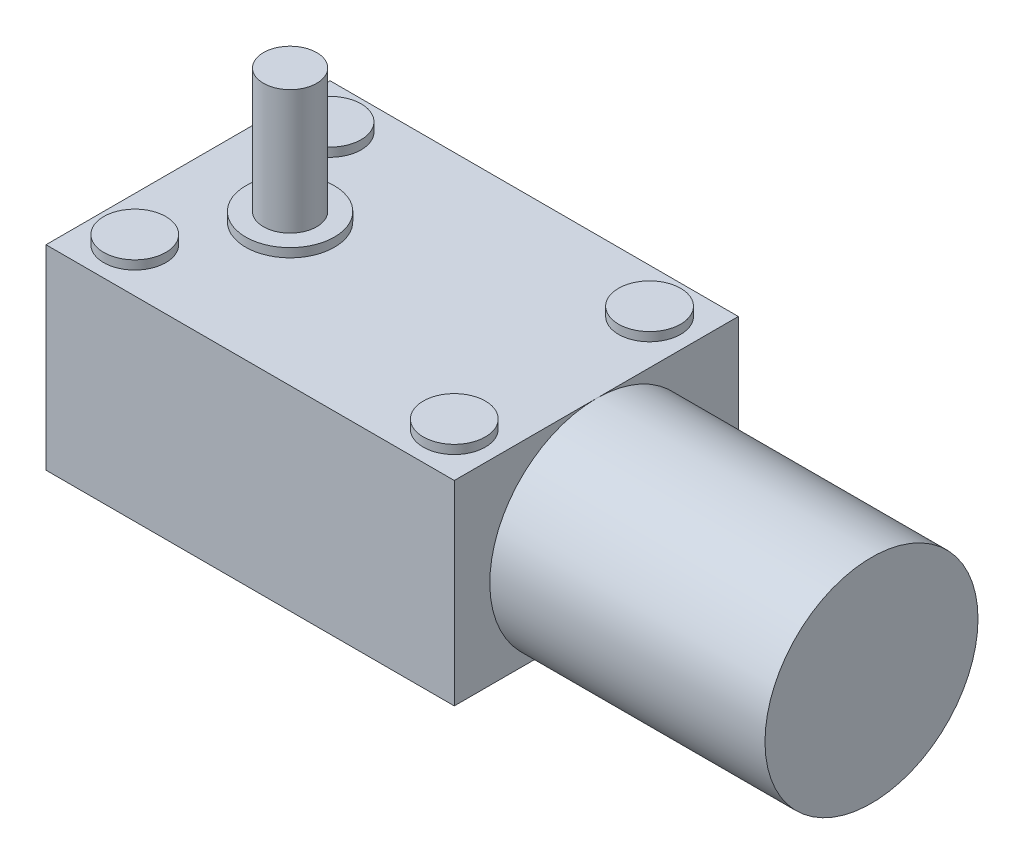
ISO-10303-21;
HEADER;
FILE_DESCRIPTION(('STEP AP214'),'2;1');
FILE_NAME('part.step','',(''),(''),'','','');
FILE_SCHEMA(('AUTOMOTIVE_DESIGN { 1 0 10303 214 1 1 1 1 }'));
ENDSEC;
DATA;
#1=APPLICATION_CONTEXT('core data for automotive mechanical design processes');
#2=APPLICATION_PROTOCOL_DEFINITION('international standard','automotive_design',2000,#1);
#3=PRODUCT_CONTEXT('',#1,'mechanical');
#4=PRODUCT('Part','Part','',(#3));
#5=PRODUCT_RELATED_PRODUCT_CATEGORY('part','',(#4));
#6=PRODUCT_DEFINITION_FORMATION('','',#4);
#7=PRODUCT_DEFINITION_CONTEXT('part definition',#1,'design');
#8=PRODUCT_DEFINITION('design','',#6,#7);
#9=PRODUCT_DEFINITION_SHAPE('','',#8);
#10=(LENGTH_UNIT() NAMED_UNIT(*) SI_UNIT(.MILLI.,.METRE.));
#11=(NAMED_UNIT(*) PLANE_ANGLE_UNIT() SI_UNIT($,.RADIAN.));
#12=(NAMED_UNIT(*) SI_UNIT($,.STERADIAN.) SOLID_ANGLE_UNIT());
#13=UNCERTAINTY_MEASURE_WITH_UNIT(LENGTH_MEASURE(1.E-05),#10,'distance_accuracy_value','');
#14=(GEOMETRIC_REPRESENTATION_CONTEXT(3) GLOBAL_UNCERTAINTY_ASSIGNED_CONTEXT((#13)) GLOBAL_UNIT_ASSIGNED_CONTEXT((#10,
#11,#12)) REPRESENTATION_CONTEXT('',''));
#15=CARTESIAN_POINT('',(0.,0.,0.));
#16=DIRECTION('',(0.,0.,1.));
#17=DIRECTION('',(1.,0.,0.));
#18=AXIS2_PLACEMENT_3D('',#15,#16,#17);
#19=CARTESIAN_POINT('',(23.,22.,16.));
#20=DIRECTION('',(-1.,0.,0.));
#21=DIRECTION('',(0.,0.,1.));
#22=AXIS2_PLACEMENT_3D('',#19,#20,#21);
#23=PLANE('',#22);
#24=CARTESIAN_POINT('',(23.,10.,0.));
#25=DIRECTION('',(1.,0.,0.));
#26=DIRECTION('',(0.,0.,-1.));
#27=AXIS2_PLACEMENT_3D('',#24,#25,#26);
#28=CIRCLE('',#27,12.);
#29=CARTESIAN_POINT('',(23.,22.,0.));
#30=VERTEX_POINT('',#29);
#31=CARTESIAN_POINT('',(23.,0.,6.63324958071081));
#32=VERTEX_POINT('',#31);
#33=EDGE_CURVE('E110',#30,#32,#28,.T.);
#34=ORIENTED_EDGE('',*,*,#33,.F.);
#35=DIRECTION('',(0.,0.,-1.));
#36=VECTOR('',#35,1.);
#37=CARTESIAN_POINT('',(23.,22.,16.));
#38=LINE('',#37,#36);
#39=CARTESIAN_POINT('',(23.,22.,16.));
#40=VERTEX_POINT('',#39);
#41=EDGE_CURVE('E91',#40,#30,#38,.T.);
#42=ORIENTED_EDGE('',*,*,#41,.F.);
#43=DIRECTION('',(0.,-1.,0.));
#44=VECTOR('',#43,1.);
#45=CARTESIAN_POINT('',(23.,22.,16.));
#46=LINE('',#45,#44);
#47=CARTESIAN_POINT('',(23.,0.,16.));
#48=VERTEX_POINT('',#47);
#49=EDGE_CURVE('E166',#40,#48,#46,.T.);
#50=ORIENTED_EDGE('',*,*,#49,.T.);
#51=DIRECTION('',(0.,0.,-1.));
#52=VECTOR('',#51,1.);
#53=CARTESIAN_POINT('',(23.,0.,16.));
#54=LINE('',#53,#52);
#55=EDGE_CURVE('E111',#48,#32,#54,.T.);
#56=ORIENTED_EDGE('',*,*,#55,.T.);
#57=EDGE_LOOP('',(#34,#42,#50,#56));
#58=FACE_BOUND('',#57,.T.);
#59=ADVANCED_FACE('F39',(#58),#23,.F.);
#60=CARTESIAN_POINT('',(23.,0.,-6.63324958071081));
#61=VERTEX_POINT('',#60);
#62=EDGE_CURVE('E55',#61,#30,#28,.T.);
#63=ORIENTED_EDGE('',*,*,#62,.F.);
#64=CARTESIAN_POINT('',(23.,0.,-16.));
#65=VERTEX_POINT('',#64);
#66=EDGE_CURVE('E145',#61,#65,#54,.T.);
#67=ORIENTED_EDGE('',*,*,#66,.T.);
#68=DIRECTION('',(0.,-1.,0.));
#69=VECTOR('',#68,1.);
#70=CARTESIAN_POINT('',(23.,22.,-16.));
#71=LINE('',#70,#69);
#72=CARTESIAN_POINT('',(23.,22.,-16.));
#73=VERTEX_POINT('',#72);
#74=EDGE_CURVE('E106',#73,#65,#71,.T.);
#75=ORIENTED_EDGE('',*,*,#74,.F.);
#76=EDGE_CURVE('E93',#30,#73,#38,.T.);
#77=ORIENTED_EDGE('',*,*,#76,.F.);
#78=EDGE_LOOP('',(#63,#67,#75,#77));
#79=FACE_BOUND('',#78,.T.);
#80=ADVANCED_FACE('F41',(#79),#23,.F.);
#81=CARTESIAN_POINT('',(-23.,22.,-16.));
#82=DIRECTION('',(0.,0.,1.));
#83=DIRECTION('',(1.,0.,0.));
#84=AXIS2_PLACEMENT_3D('',#81,#82,#83);
#85=PLANE('',#84);
#86=DIRECTION('',(-1.,0.,0.));
#87=VECTOR('',#86,1.);
#88=CARTESIAN_POINT('',(-23.,0.,-16.));
#89=LINE('',#88,#87);
#90=CARTESIAN_POINT('',(-23.,0.,-16.));
#91=VERTEX_POINT('',#90);
#92=EDGE_CURVE('E155',#65,#91,#89,.T.);
#93=ORIENTED_EDGE('',*,*,#92,.T.);
#94=DIRECTION('',(0.,-1.,0.));
#95=VECTOR('',#94,1.);
#96=CARTESIAN_POINT('',(-23.,22.,-16.));
#97=LINE('',#96,#95);
#98=CARTESIAN_POINT('',(-23.,22.,-16.));
#99=VERTEX_POINT('',#98);
#100=EDGE_CURVE('E127',#99,#91,#97,.T.);
#101=ORIENTED_EDGE('',*,*,#100,.F.);
#102=DIRECTION('',(-1.,0.,0.));
#103=VECTOR('',#102,1.);
#104=CARTESIAN_POINT('',(-23.,22.,-16.));
#105=LINE('',#104,#103);
#106=EDGE_CURVE('E102',#73,#99,#105,.T.);
#107=ORIENTED_EDGE('',*,*,#106,.F.);
#108=ORIENTED_EDGE('',*,*,#74,.T.);
#109=EDGE_LOOP('',(#93,#101,#107,#108));
#110=FACE_BOUND('',#109,.T.);
#111=ADVANCED_FACE('F218',(#110),#85,.F.);
#112=CARTESIAN_POINT('',(-23.,22.,16.));
#113=DIRECTION('',(1.,0.,0.));
#114=DIRECTION('',(0.,0.,-1.));
#115=AXIS2_PLACEMENT_3D('',#112,#113,#114);
#116=PLANE('',#115);
#117=DIRECTION('',(0.,0.,1.));
#118=VECTOR('',#117,1.);
#119=CARTESIAN_POINT('',(-23.,0.,16.));
#120=LINE('',#119,#118);
#121=CARTESIAN_POINT('',(-23.,0.,16.));
#122=VERTEX_POINT('',#121);
#123=EDGE_CURVE('E157',#91,#122,#120,.T.);
#124=ORIENTED_EDGE('',*,*,#123,.T.);
#125=DIRECTION('',(0.,-1.,0.));
#126=VECTOR('',#125,1.);
#127=CARTESIAN_POINT('',(-23.,22.,16.));
#128=LINE('',#127,#126);
#129=CARTESIAN_POINT('',(-23.,22.,16.));
#130=VERTEX_POINT('',#129);
#131=EDGE_CURVE('E169',#130,#122,#128,.T.);
#132=ORIENTED_EDGE('',*,*,#131,.F.);
#133=DIRECTION('',(0.,0.,1.));
#134=VECTOR('',#133,1.);
#135=CARTESIAN_POINT('',(-23.,22.,16.));
#136=LINE('',#135,#134);
#137=EDGE_CURVE('E434',#99,#130,#136,.T.);
#138=ORIENTED_EDGE('',*,*,#137,.F.);
#139=ORIENTED_EDGE('',*,*,#100,.T.);
#140=EDGE_LOOP('',(#124,#132,#138,#139));
#141=FACE_BOUND('',#140,.T.);
#142=ADVANCED_FACE('F222',(#141),#116,.F.);
#143=CARTESIAN_POINT('',(-23.,22.,16.));
#144=DIRECTION('',(0.,0.,-1.));
#145=DIRECTION('',(-1.,0.,0.));
#146=AXIS2_PLACEMENT_3D('',#143,#144,#145);
#147=PLANE('',#146);
#148=DIRECTION('',(1.,0.,0.));
#149=VECTOR('',#148,1.);
#150=CARTESIAN_POINT('',(-23.,0.,16.));
#151=LINE('',#150,#149);
#152=EDGE_CURVE('E108',#122,#48,#151,.T.);
#153=ORIENTED_EDGE('',*,*,#152,.T.);
#154=ORIENTED_EDGE('',*,*,#49,.F.);
#155=DIRECTION('',(1.,0.,0.));
#156=VECTOR('',#155,1.);
#157=CARTESIAN_POINT('',(-23.,22.,16.));
#158=LINE('',#157,#156);
#159=EDGE_CURVE('E96',#130,#40,#158,.T.);
#160=ORIENTED_EDGE('',*,*,#159,.F.);
#161=ORIENTED_EDGE('',*,*,#131,.T.);
#162=EDGE_LOOP('',(#153,#154,#160,#161));
#163=FACE_BOUND('',#162,.T.);
#164=ADVANCED_FACE('F191',(#163),#147,.F.);
#165=CARTESIAN_POINT('',(0.,22.,0.));
#166=DIRECTION('',(0.,-1.,0.));
#167=DIRECTION('',(0.,0.,-1.));
#168=AXIS2_PLACEMENT_3D('',#165,#166,#167);
#169=PLANE('',#168);
#170=CARTESIAN_POINT('',(-18.,22.,-11.));
#171=DIRECTION('',(0.,-1.,0.));
#172=DIRECTION('',(0.,0.,-1.));
#173=AXIS2_PLACEMENT_3D('',#170,#171,#172);
#174=CIRCLE('',#173,3.5);
#175=CARTESIAN_POINT('',(-18.,22.,-14.5));
#176=VERTEX_POINT('',#175);
#177=EDGE_CURVE('E11',#176,#176,#174,.F.);
#178=ORIENTED_EDGE('',*,*,#177,.F.);
#179=EDGE_LOOP('',(#178));
#180=FACE_BOUND('',#179,.T.);
#181=CARTESIAN_POINT('',(-18.,22.,11.));
#182=DIRECTION('',(0.,-1.,0.));
#183=DIRECTION('',(0.,0.,-1.));
#184=AXIS2_PLACEMENT_3D('',#181,#182,#183);
#185=CIRCLE('',#184,3.5);
#186=CARTESIAN_POINT('',(-18.,22.,7.5));
#187=VERTEX_POINT('',#186);
#188=EDGE_CURVE('E48',#187,#187,#185,.F.);
#189=ORIENTED_EDGE('',*,*,#188,.F.);
#190=EDGE_LOOP('',(#189));
#191=FACE_BOUND('',#190,.T.);
#192=CARTESIAN_POINT('',(18.,22.,11.));
#193=DIRECTION('',(0.,-1.,0.));
#194=DIRECTION('',(0.,0.,-1.));
#195=AXIS2_PLACEMENT_3D('',#192,#193,#194);
#196=CIRCLE('',#195,3.5);
#197=CARTESIAN_POINT('',(18.,22.,7.5));
#198=VERTEX_POINT('',#197);
#199=EDGE_CURVE('E179',#198,#198,#196,.F.);
#200=ORIENTED_EDGE('',*,*,#199,.F.);
#201=EDGE_LOOP('',(#200));
#202=FACE_BOUND('',#201,.T.);
#203=CARTESIAN_POINT('',(18.,22.,-11.));
#204=DIRECTION('',(0.,-1.,0.));
#205=DIRECTION('',(0.,0.,-1.));
#206=AXIS2_PLACEMENT_3D('',#203,#204,#205);
#207=CIRCLE('',#206,3.5);
#208=CARTESIAN_POINT('',(18.,22.,-14.5));
#209=VERTEX_POINT('',#208);
#210=EDGE_CURVE('E175',#209,#209,#207,.F.);
#211=ORIENTED_EDGE('',*,*,#210,.F.);
#212=EDGE_LOOP('',(#211));
#213=FACE_BOUND('',#212,.T.);
#214=CARTESIAN_POINT('',(-11.5,22.,0.));
#215=DIRECTION('',(0.,-1.,0.));
#216=DIRECTION('',(0.,0.,-1.));
#217=AXIS2_PLACEMENT_3D('',#214,#215,#216);
#218=CIRCLE('',#217,5.);
#219=CARTESIAN_POINT('',(-11.5,22.,-5.));
#220=VERTEX_POINT('',#219);
#221=EDGE_CURVE('E121',#220,#220,#218,.F.);
#222=ORIENTED_EDGE('',*,*,#221,.F.);
#223=EDGE_LOOP('',(#222));
#224=FACE_BOUND('',#223,.T.);
#225=ORIENTED_EDGE('',*,*,#41,.T.);
#226=ORIENTED_EDGE('',*,*,#76,.T.);
#227=ORIENTED_EDGE('',*,*,#106,.T.);
#228=ORIENTED_EDGE('',*,*,#137,.T.);
#229=ORIENTED_EDGE('',*,*,#159,.T.);
#230=EDGE_LOOP('',(#225,#226,#227,#228,#229));
#231=FACE_BOUND('',#230,.T.);
#232=ADVANCED_FACE('F92',(#180,#191,#202,#213,#224,#231),#169,.F.);
#233=CARTESIAN_POINT('',(0.,0.,0.));
#234=DIRECTION('',(0.,-1.,0.));
#235=DIRECTION('',(0.,0.,-1.));
#236=AXIS2_PLACEMENT_3D('',#233,#234,#235);
#237=PLANE('',#236);
#238=ORIENTED_EDGE('',*,*,#55,.F.);
#239=ORIENTED_EDGE('',*,*,#152,.F.);
#240=ORIENTED_EDGE('',*,*,#123,.F.);
#241=ORIENTED_EDGE('',*,*,#92,.F.);
#242=ORIENTED_EDGE('',*,*,#66,.F.);
#243=EDGE_CURVE('E62',#32,#61,#54,.T.);
#244=ORIENTED_EDGE('',*,*,#243,.F.);
#245=EDGE_LOOP('',(#238,#239,#240,#241,#242,#244));
#246=FACE_BOUND('',#245,.T.);
#247=ADVANCED_FACE('F190',(#246),#237,.T.);
#248=CARTESIAN_POINT('',(23.,10.,0.));
#249=DIRECTION('',(1.,0.,0.));
#250=DIRECTION('',(0.,0.,-1.));
#251=AXIS2_PLACEMENT_3D('',#248,#249,#250);
#252=PLANE('',#251);
#253=EDGE_CURVE('E117',#32,#61,#28,.T.);
#254=ORIENTED_EDGE('',*,*,#253,.F.);
#255=ORIENTED_EDGE('',*,*,#243,.T.);
#256=EDGE_LOOP('',(#254,#255));
#257=FACE_BOUND('',#256,.T.);
#258=ADVANCED_FACE('F233',(#257),#252,.F.);
#259=CARTESIAN_POINT('',(54.,10.,0.));
#260=DIRECTION('',(-1.,0.,0.));
#261=DIRECTION('',(0.,0.,1.));
#262=AXIS2_PLACEMENT_3D('',#259,#260,#261);
#263=CYLINDRICAL_SURFACE('',#262,12.);
#264=CARTESIAN_POINT('',(54.,10.,0.));
#265=DIRECTION('',(1.,0.,0.));
#266=DIRECTION('',(0.,0.,-1.));
#267=AXIS2_PLACEMENT_3D('',#264,#265,#266);
#268=CIRCLE('',#267,12.);
#269=CARTESIAN_POINT('',(54.,10.,-12.));
#270=VERTEX_POINT('',#269);
#271=EDGE_CURVE('E116',#270,#270,#268,.T.);
#272=ORIENTED_EDGE('',*,*,#271,.F.);
#273=EDGE_LOOP('',(#272));
#274=FACE_BOUND('',#273,.T.);
#275=ORIENTED_EDGE('',*,*,#33,.T.);
#276=ORIENTED_EDGE('',*,*,#253,.T.);
#277=ORIENTED_EDGE('',*,*,#62,.T.);
#278=EDGE_LOOP('',(#275,#276,#277));
#279=FACE_BOUND('',#278,.T.);
#280=ADVANCED_FACE('F119',(#274,#279),#263,.T.);
#281=CARTESIAN_POINT('',(54.,10.,0.));
#282=DIRECTION('',(1.,0.,0.));
#283=DIRECTION('',(0.,0.,-1.));
#284=AXIS2_PLACEMENT_3D('',#281,#282,#283);
#285=PLANE('',#284);
#286=ORIENTED_EDGE('',*,*,#271,.T.);
#287=EDGE_LOOP('',(#286));
#288=FACE_BOUND('',#287,.T.);
#289=ADVANCED_FACE('F203',(#288),#285,.T.);
#290=CARTESIAN_POINT('',(-11.5,23.,0.));
#291=DIRECTION('',(0.,-1.,0.));
#292=DIRECTION('',(0.,0.,-1.));
#293=AXIS2_PLACEMENT_3D('',#290,#291,#292);
#294=CYLINDRICAL_SURFACE('',#293,5.);
#295=CARTESIAN_POINT('',(-11.5,23.,0.));
#296=DIRECTION('',(0.,1.,0.));
#297=DIRECTION('',(0.,0.,1.));
#298=AXIS2_PLACEMENT_3D('',#295,#296,#297);
#299=CIRCLE('',#298,5.);
#300=CARTESIAN_POINT('',(-11.5,23.,5.));
#301=VERTEX_POINT('',#300);
#302=EDGE_CURVE('E131',#301,#301,#299,.T.);
#303=ORIENTED_EDGE('',*,*,#302,.F.);
#304=EDGE_LOOP('',(#303));
#305=FACE_BOUND('',#304,.T.);
#306=ORIENTED_EDGE('',*,*,#221,.T.);
#307=EDGE_LOOP('',(#306));
#308=FACE_BOUND('',#307,.T.);
#309=ADVANCED_FACE('F200',(#305,#308),#294,.T.);
#310=CARTESIAN_POINT('',(-11.5,23.,0.));
#311=DIRECTION('',(0.,1.,0.));
#312=DIRECTION('',(0.,0.,1.));
#313=AXIS2_PLACEMENT_3D('',#310,#311,#312);
#314=PLANE('',#313);
#315=CARTESIAN_POINT('',(-11.5,23.,0.));
#316=DIRECTION('',(0.,1.,0.));
#317=DIRECTION('',(0.,0.,1.));
#318=AXIS2_PLACEMENT_3D('',#315,#316,#317);
#319=CIRCLE('',#318,3.);
#320=CARTESIAN_POINT('',(-11.5,23.,3.));
#321=VERTEX_POINT('',#320);
#322=EDGE_CURVE('E125',#321,#321,#319,.T.);
#323=ORIENTED_EDGE('',*,*,#322,.F.);
#324=EDGE_LOOP('',(#323));
#325=FACE_BOUND('',#324,.T.);
#326=ORIENTED_EDGE('',*,*,#302,.T.);
#327=EDGE_LOOP('',(#326));
#328=FACE_BOUND('',#327,.T.);
#329=ADVANCED_FACE('F202',(#325,#328),#314,.T.);
#330=CARTESIAN_POINT('',(-11.5,37.,0.));
#331=DIRECTION('',(0.,-1.,0.));
#332=DIRECTION('',(0.,0.,-1.));
#333=AXIS2_PLACEMENT_3D('',#330,#331,#332);
#334=CYLINDRICAL_SURFACE('',#333,3.);
#335=CARTESIAN_POINT('',(-11.5,37.,0.));
#336=DIRECTION('',(0.,1.,0.));
#337=DIRECTION('',(0.,0.,1.));
#338=AXIS2_PLACEMENT_3D('',#335,#336,#337);
#339=CIRCLE('',#338,3.);
#340=CARTESIAN_POINT('',(-11.5,37.,3.));
#341=VERTEX_POINT('',#340);
#342=EDGE_CURVE('E134',#341,#341,#339,.T.);
#343=ORIENTED_EDGE('',*,*,#342,.F.);
#344=EDGE_LOOP('',(#343));
#345=FACE_BOUND('',#344,.T.);
#346=ORIENTED_EDGE('',*,*,#322,.T.);
#347=EDGE_LOOP('',(#346));
#348=FACE_BOUND('',#347,.T.);
#349=ADVANCED_FACE('F210',(#345,#348),#334,.T.);
#350=CARTESIAN_POINT('',(-11.5,37.,0.));
#351=DIRECTION('',(0.,1.,0.));
#352=DIRECTION('',(0.,0.,1.));
#353=AXIS2_PLACEMENT_3D('',#350,#351,#352);
#354=PLANE('',#353);
#355=ORIENTED_EDGE('',*,*,#342,.T.);
#356=EDGE_LOOP('',(#355));
#357=FACE_BOUND('',#356,.T.);
#358=ADVANCED_FACE('F271',(#357),#354,.T.);
#359=CARTESIAN_POINT('',(18.,23.,-11.));
#360=DIRECTION('',(0.,-1.,0.));
#361=DIRECTION('',(0.,0.,-1.));
#362=AXIS2_PLACEMENT_3D('',#359,#360,#361);
#363=CYLINDRICAL_SURFACE('',#362,3.5);
#364=CARTESIAN_POINT('',(18.,23.,-11.));
#365=DIRECTION('',(0.,1.,0.));
#366=DIRECTION('',(0.,0.,1.));
#367=AXIS2_PLACEMENT_3D('',#364,#365,#366);
#368=CIRCLE('',#367,3.5);
#369=CARTESIAN_POINT('',(18.,23.,-7.5));
#370=VERTEX_POINT('',#369);
#371=EDGE_CURVE('E140',#370,#370,#368,.T.);
#372=ORIENTED_EDGE('',*,*,#371,.F.);
#373=EDGE_LOOP('',(#372));
#374=FACE_BOUND('',#373,.T.);
#375=ORIENTED_EDGE('',*,*,#210,.T.);
#376=EDGE_LOOP('',(#375));
#377=FACE_BOUND('',#376,.T.);
#378=ADVANCED_FACE('F281',(#374,#377),#363,.T.);
#379=CARTESIAN_POINT('',(18.,23.,-11.));
#380=DIRECTION('',(0.,1.,0.));
#381=DIRECTION('',(0.,0.,1.));
#382=AXIS2_PLACEMENT_3D('',#379,#380,#381);
#383=PLANE('',#382);
#384=ORIENTED_EDGE('',*,*,#371,.T.);
#385=EDGE_LOOP('',(#384));
#386=FACE_BOUND('',#385,.T.);
#387=ADVANCED_FACE('F299',(#386),#383,.T.);
#388=CARTESIAN_POINT('',(18.,23.,11.));
#389=DIRECTION('',(0.,-1.,0.));
#390=DIRECTION('',(0.,0.,-1.));
#391=AXIS2_PLACEMENT_3D('',#388,#389,#390);
#392=CYLINDRICAL_SURFACE('',#391,3.5);
#393=CARTESIAN_POINT('',(18.,23.,11.));
#394=DIRECTION('',(0.,1.,0.));
#395=DIRECTION('',(0.,0.,1.));
#396=AXIS2_PLACEMENT_3D('',#393,#394,#395);
#397=CIRCLE('',#396,3.5);
#398=CARTESIAN_POINT('',(18.,23.,14.5));
#399=VERTEX_POINT('',#398);
#400=EDGE_CURVE('E380',#399,#399,#397,.T.);
#401=ORIENTED_EDGE('',*,*,#400,.F.);
#402=EDGE_LOOP('',(#401));
#403=FACE_BOUND('',#402,.T.);
#404=ORIENTED_EDGE('',*,*,#199,.T.);
#405=EDGE_LOOP('',(#404));
#406=FACE_BOUND('',#405,.T.);
#407=ADVANCED_FACE('F309',(#403,#406),#392,.T.);
#408=CARTESIAN_POINT('',(18.,23.,11.));
#409=DIRECTION('',(0.,1.,0.));
#410=DIRECTION('',(0.,0.,1.));
#411=AXIS2_PLACEMENT_3D('',#408,#409,#410);
#412=PLANE('',#411);
#413=ORIENTED_EDGE('',*,*,#400,.T.);
#414=EDGE_LOOP('',(#413));
#415=FACE_BOUND('',#414,.T.);
#416=ADVANCED_FACE('F319',(#415),#412,.T.);
#417=CARTESIAN_POINT('',(-18.,23.,11.));
#418=DIRECTION('',(0.,-1.,0.));
#419=DIRECTION('',(0.,0.,-1.));
#420=AXIS2_PLACEMENT_3D('',#417,#418,#419);
#421=CYLINDRICAL_SURFACE('',#420,3.5);
#422=CARTESIAN_POINT('',(-18.,23.,11.));
#423=DIRECTION('',(0.,1.,0.));
#424=DIRECTION('',(0.,0.,1.));
#425=AXIS2_PLACEMENT_3D('',#422,#423,#424);
#426=CIRCLE('',#425,3.5);
#427=CARTESIAN_POINT('',(-18.,23.,14.5));
#428=VERTEX_POINT('',#427);
#429=EDGE_CURVE('E376',#428,#428,#426,.T.);
#430=ORIENTED_EDGE('',*,*,#429,.F.);
#431=EDGE_LOOP('',(#430));
#432=FACE_BOUND('',#431,.T.);
#433=ORIENTED_EDGE('',*,*,#188,.T.);
#434=EDGE_LOOP('',(#433));
#435=FACE_BOUND('',#434,.T.);
#436=ADVANCED_FACE('F186',(#432,#435),#421,.T.);
#437=CARTESIAN_POINT('',(-18.,23.,11.));
#438=DIRECTION('',(0.,1.,0.));
#439=DIRECTION('',(0.,0.,1.));
#440=AXIS2_PLACEMENT_3D('',#437,#438,#439);
#441=PLANE('',#440);
#442=ORIENTED_EDGE('',*,*,#429,.T.);
#443=EDGE_LOOP('',(#442));
#444=FACE_BOUND('',#443,.T.);
#445=ADVANCED_FACE('F338',(#444),#441,.T.);
#446=CARTESIAN_POINT('',(-18.,23.,-11.));
#447=DIRECTION('',(0.,-1.,0.));
#448=DIRECTION('',(0.,0.,-1.));
#449=AXIS2_PLACEMENT_3D('',#446,#447,#448);
#450=CYLINDRICAL_SURFACE('',#449,3.5);
#451=CARTESIAN_POINT('',(-18.,23.,-11.));
#452=DIRECTION('',(0.,1.,0.));
#453=DIRECTION('',(0.,0.,1.));
#454=AXIS2_PLACEMENT_3D('',#451,#452,#453);
#455=CIRCLE('',#454,3.5);
#456=CARTESIAN_POINT('',(-18.,23.,-7.5));
#457=VERTEX_POINT('',#456);
#458=EDGE_CURVE('E374',#457,#457,#455,.T.);
#459=ORIENTED_EDGE('',*,*,#458,.F.);
#460=EDGE_LOOP('',(#459));
#461=FACE_BOUND('',#460,.T.);
#462=ORIENTED_EDGE('',*,*,#177,.T.);
#463=EDGE_LOOP('',(#462));
#464=FACE_BOUND('',#463,.T.);
#465=ADVANCED_FACE('F348',(#461,#464),#450,.T.);
#466=CARTESIAN_POINT('',(-18.,23.,-11.));
#467=DIRECTION('',(0.,1.,0.));
#468=DIRECTION('',(0.,0.,1.));
#469=AXIS2_PLACEMENT_3D('',#466,#467,#468);
#470=PLANE('',#469);
#471=ORIENTED_EDGE('',*,*,#458,.T.);
#472=EDGE_LOOP('',(#471));
#473=FACE_BOUND('',#472,.T.);
#474=ADVANCED_FACE('F358',(#473),#470,.T.);
#475=CLOSED_SHELL('',(#59,#80,#111,#142,#164,#232,#247,#258,#280,#289,#309,#329,#349,#358,#378,
#387,#407,#416,#436,#445,#465,#474));
#476=MANIFOLD_SOLID_BREP('B2',#475);
#477=ADVANCED_BREP_SHAPE_REPRESENTATION('',(#18,#476),#14);
#478=SHAPE_DEFINITION_REPRESENTATION(#9,#477);
ENDSEC;
END-ISO-10303-21;
